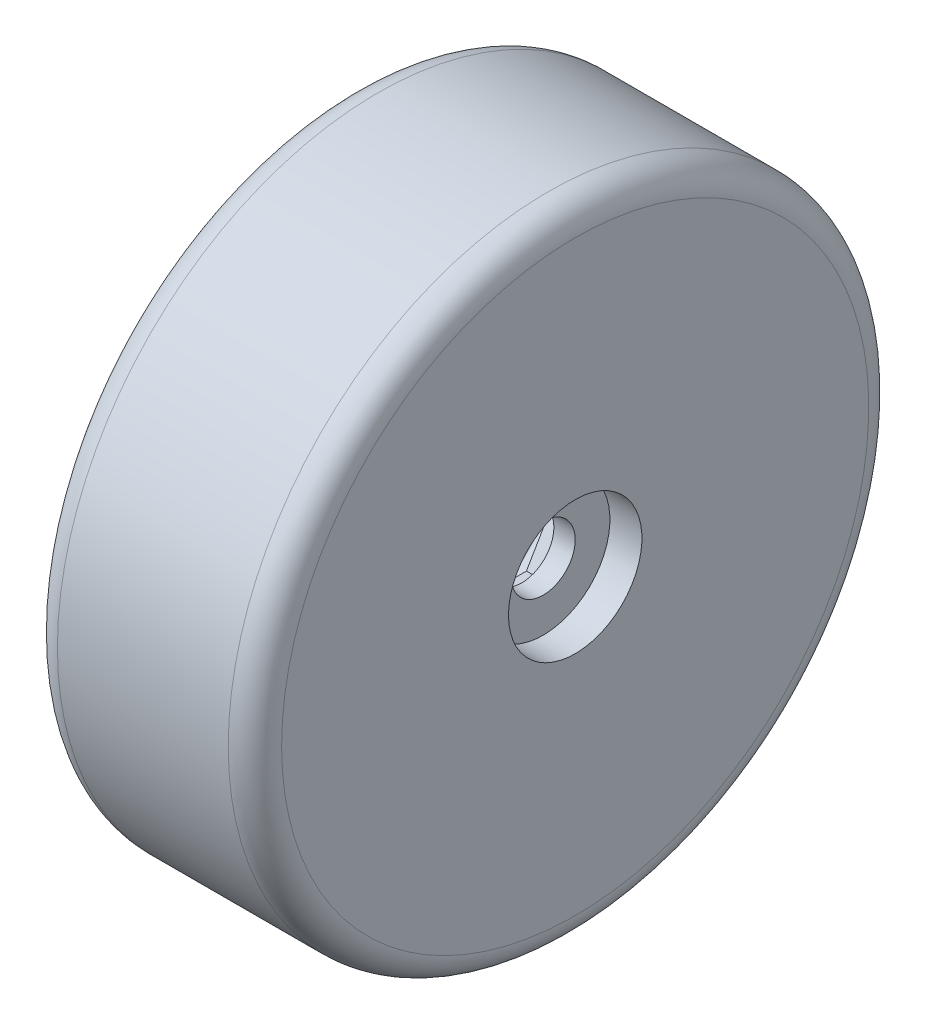
ISO-10303-21;
HEADER;
FILE_DESCRIPTION(('STEP AP214'),'2;1');
FILE_NAME('part.step','',(''),(''),'','','');
FILE_SCHEMA(('AUTOMOTIVE_DESIGN { 1 0 10303 214 1 1 1 1 }'));
ENDSEC;
DATA;
#1=APPLICATION_CONTEXT('core data for automotive mechanical design processes');
#2=APPLICATION_PROTOCOL_DEFINITION('international standard','automotive_design',2000,#1);
#3=PRODUCT_CONTEXT('',#1,'mechanical');
#4=PRODUCT('Part','Part','',(#3));
#5=PRODUCT_RELATED_PRODUCT_CATEGORY('part','',(#4));
#6=PRODUCT_DEFINITION_FORMATION('','',#4);
#7=PRODUCT_DEFINITION_CONTEXT('part definition',#1,'design');
#8=PRODUCT_DEFINITION('design','',#6,#7);
#9=PRODUCT_DEFINITION_SHAPE('','',#8);
#10=(LENGTH_UNIT() NAMED_UNIT(*) SI_UNIT(.MILLI.,.METRE.));
#11=(NAMED_UNIT(*) PLANE_ANGLE_UNIT() SI_UNIT($,.RADIAN.));
#12=(NAMED_UNIT(*) SI_UNIT($,.STERADIAN.) SOLID_ANGLE_UNIT());
#13=UNCERTAINTY_MEASURE_WITH_UNIT(LENGTH_MEASURE(1.E-05),#10,'distance_accuracy_value','');
#14=(GEOMETRIC_REPRESENTATION_CONTEXT(3) GLOBAL_UNCERTAINTY_ASSIGNED_CONTEXT((#13)) GLOBAL_UNIT_ASSIGNED_CONTEXT((#10,
#11,#12)) REPRESENTATION_CONTEXT('',''));
#15=CARTESIAN_POINT('',(0.,0.,0.));
#16=DIRECTION('',(0.,0.,1.));
#17=DIRECTION('',(1.,0.,0.));
#18=AXIS2_PLACEMENT_3D('',#15,#16,#17);
#19=CARTESIAN_POINT('',(-33.6279069767442,0.,0.));
#20=DIRECTION('',(-1.,0.,0.));
#21=DIRECTION('',(0.,0.,1.));
#22=AXIS2_PLACEMENT_3D('',#19,#20,#21);
#23=CYLINDRICAL_SURFACE('',#22,6.);
#24=CARTESIAN_POINT('',(-5.99999999999999,0.,0.));
#25=DIRECTION('',(-1.,0.,0.));
#26=DIRECTION('',(0.,0.,1.));
#27=AXIS2_PLACEMENT_3D('',#24,#25,#26);
#28=CIRCLE('',#27,6.);
#29=CARTESIAN_POINT('',(-5.99999999999999,0.,6.));
#30=VERTEX_POINT('',#29);
#31=EDGE_CURVE('E41',#30,#30,#28,.T.);
#32=ORIENTED_EDGE('',*,*,#31,.F.);
#33=EDGE_LOOP('',(#32));
#34=FACE_BOUND('',#33,.T.);
#35=CARTESIAN_POINT('',(-9.99999999999999,0.,0.));
#36=DIRECTION('',(-1.,0.,0.));
#37=DIRECTION('',(0.,0.,1.));
#38=AXIS2_PLACEMENT_3D('',#35,#36,#37);
#39=CIRCLE('',#38,6.);
#40=CARTESIAN_POINT('',(-9.99999999999999,0.,6.));
#41=VERTEX_POINT('',#40);
#42=EDGE_CURVE('E154',#41,#41,#39,.T.);
#43=ORIENTED_EDGE('',*,*,#42,.T.);
#44=EDGE_LOOP('',(#43));
#45=FACE_BOUND('',#44,.T.);
#46=ADVANCED_FACE('F38',(#34,#45),#23,.F.);
#47=CARTESIAN_POINT('',(0.,-6.,0.));
#48=DIRECTION('',(1.,0.,0.));
#49=DIRECTION('',(0.,0.,-1.));
#50=AXIS2_PLACEMENT_3D('',#47,#48,#49);
#51=PLANE('',#50);
#52=CARTESIAN_POINT('',(0.,0.,0.));
#53=DIRECTION('',(-1.,0.,0.));
#54=DIRECTION('',(0.,0.,1.));
#55=AXIS2_PLACEMENT_3D('',#52,#53,#54);
#56=CIRCLE('',#55,12.5);
#57=CARTESIAN_POINT('',(0.,0.,12.5));
#58=VERTEX_POINT('',#57);
#59=EDGE_CURVE('E222',#58,#58,#56,.T.);
#60=ORIENTED_EDGE('',*,*,#59,.T.);
#61=EDGE_LOOP('',(#60));
#62=FACE_BOUND('',#61,.T.);
#63=CARTESIAN_POINT('',(0.,0.,0.));
#64=DIRECTION('',(-1.,0.,0.));
#65=DIRECTION('',(0.,0.,1.));
#66=AXIS2_PLACEMENT_3D('',#63,#64,#65);
#67=CIRCLE('',#66,55.);
#68=CARTESIAN_POINT('',(0.,0.,55.));
#69=VERTEX_POINT('',#68);
#70=EDGE_CURVE('E11',#69,#69,#67,.T.);
#71=ORIENTED_EDGE('',*,*,#70,.F.);
#72=EDGE_LOOP('',(#71));
#73=FACE_BOUND('',#72,.T.);
#74=ADVANCED_FACE('F211',(#62,#73),#51,.T.);
#75=CARTESIAN_POINT('',(-4.99999999999999,0.,0.));
#76=DIRECTION('',(-1.,0.,0.));
#77=DIRECTION('',(0.,0.,1.));
#78=AXIS2_PLACEMENT_3D('',#75,#76,#77);
#79=TOROIDAL_SURFACE('',#78,55.,5.);
#80=ORIENTED_EDGE('',*,*,#70,.T.);
#81=EDGE_LOOP('',(#80));
#82=FACE_BOUND('',#81,.T.);
#83=CARTESIAN_POINT('',(-5.00000000000003,0.,0.));
#84=DIRECTION('',(-1.,0.,0.));
#85=DIRECTION('',(0.,0.,1.));
#86=AXIS2_PLACEMENT_3D('',#83,#84,#85);
#87=CIRCLE('',#86,60.);
#88=CARTESIAN_POINT('',(-5.00000000000003,0.,60.));
#89=VERTEX_POINT('',#88);
#90=EDGE_CURVE('E47',#89,#89,#87,.T.);
#91=ORIENTED_EDGE('',*,*,#90,.F.);
#92=EDGE_LOOP('',(#91));
#93=FACE_BOUND('',#92,.T.);
#94=ADVANCED_FACE('F216',(#82,#93),#79,.T.);
#95=CARTESIAN_POINT('',(-33.6279069767442,0.,0.));
#96=DIRECTION('',(-1.,0.,0.));
#97=DIRECTION('',(0.,0.,1.));
#98=AXIS2_PLACEMENT_3D('',#95,#96,#97);
#99=CYLINDRICAL_SURFACE('',#98,60.);
#100=ORIENTED_EDGE('',*,*,#90,.T.);
#101=EDGE_LOOP('',(#100));
#102=FACE_BOUND('',#101,.T.);
#103=CARTESIAN_POINT('',(-37.,0.,0.));
#104=DIRECTION('',(-1.,0.,0.));
#105=DIRECTION('',(0.,0.,1.));
#106=AXIS2_PLACEMENT_3D('',#103,#104,#105);
#107=CIRCLE('',#106,60.);
#108=CARTESIAN_POINT('',(-37.,0.,60.));
#109=VERTEX_POINT('',#108);
#110=EDGE_CURVE('E184',#109,#109,#107,.T.);
#111=ORIENTED_EDGE('',*,*,#110,.F.);
#112=EDGE_LOOP('',(#111));
#113=FACE_BOUND('',#112,.T.);
#114=ADVANCED_FACE('F276',(#102,#113),#99,.T.);
#115=CARTESIAN_POINT('',(-37.,0.,0.));
#116=DIRECTION('',(-1.,0.,0.));
#117=DIRECTION('',(0.,0.,1.));
#118=AXIS2_PLACEMENT_3D('',#115,#116,#117);
#119=TOROIDAL_SURFACE('',#118,55.,5.);
#120=ORIENTED_EDGE('',*,*,#110,.T.);
#121=EDGE_LOOP('',(#120));
#122=FACE_BOUND('',#121,.T.);
#123=CARTESIAN_POINT('',(-42.,0.,0.));
#124=DIRECTION('',(-1.,0.,0.));
#125=DIRECTION('',(0.,0.,1.));
#126=AXIS2_PLACEMENT_3D('',#123,#124,#125);
#127=CIRCLE('',#126,55.);
#128=CARTESIAN_POINT('',(-42.,0.,55.));
#129=VERTEX_POINT('',#128);
#130=EDGE_CURVE('E180',#129,#129,#127,.T.);
#131=ORIENTED_EDGE('',*,*,#130,.F.);
#132=EDGE_LOOP('',(#131));
#133=FACE_BOUND('',#132,.T.);
#134=ADVANCED_FACE('F272',(#122,#133),#119,.T.);
#135=CARTESIAN_POINT('',(-42.,-55.,0.));
#136=DIRECTION('',(-1.,0.,0.));
#137=DIRECTION('',(0.,0.,1.));
#138=AXIS2_PLACEMENT_3D('',#135,#136,#137);
#139=PLANE('',#138);
#140=ORIENTED_EDGE('',*,*,#130,.T.);
#141=EDGE_LOOP('',(#140));
#142=FACE_BOUND('',#141,.T.);
#143=CARTESIAN_POINT('',(-42.,0.,0.));
#144=DIRECTION('',(-1.,0.,0.));
#145=DIRECTION('',(0.,0.,1.));
#146=AXIS2_PLACEMENT_3D('',#143,#144,#145);
#147=CIRCLE('',#146,45.);
#148=CARTESIAN_POINT('',(-42.,0.,45.));
#149=VERTEX_POINT('',#148);
#150=EDGE_CURVE('E176',#149,#149,#147,.T.);
#151=ORIENTED_EDGE('',*,*,#150,.F.);
#152=EDGE_LOOP('',(#151));
#153=FACE_BOUND('',#152,.T.);
#154=ADVANCED_FACE('F268',(#142,#153),#139,.T.);
#155=CARTESIAN_POINT('',(-37.,0.,0.));
#156=DIRECTION('',(-1.,0.,0.));
#157=DIRECTION('',(0.,0.,1.));
#158=AXIS2_PLACEMENT_3D('',#155,#156,#157);
#159=TOROIDAL_SURFACE('',#158,45.,5.);
#160=ORIENTED_EDGE('',*,*,#150,.T.);
#161=EDGE_LOOP('',(#160));
#162=FACE_BOUND('',#161,.T.);
#163=CARTESIAN_POINT('',(-37.,0.,0.));
#164=DIRECTION('',(-1.,0.,0.));
#165=DIRECTION('',(0.,0.,1.));
#166=AXIS2_PLACEMENT_3D('',#163,#164,#165);
#167=CIRCLE('',#166,40.);
#168=CARTESIAN_POINT('',(-37.,0.,40.));
#169=VERTEX_POINT('',#168);
#170=EDGE_CURVE('E172',#169,#169,#167,.T.);
#171=ORIENTED_EDGE('',*,*,#170,.F.);
#172=EDGE_LOOP('',(#171));
#173=FACE_BOUND('',#172,.T.);
#174=ADVANCED_FACE('F264',(#162,#173),#159,.T.);
#175=CARTESIAN_POINT('',(-33.6279069767442,0.,0.));
#176=DIRECTION('',(-1.,0.,0.));
#177=DIRECTION('',(0.,0.,1.));
#178=AXIS2_PLACEMENT_3D('',#175,#176,#177);
#179=CYLINDRICAL_SURFACE('',#178,40.);
#180=ORIENTED_EDGE('',*,*,#170,.T.);
#181=EDGE_LOOP('',(#180));
#182=FACE_BOUND('',#181,.T.);
#183=CARTESIAN_POINT('',(-19.,0.,0.));
#184=DIRECTION('',(-1.,0.,0.));
#185=DIRECTION('',(0.,0.,1.));
#186=AXIS2_PLACEMENT_3D('',#183,#184,#185);
#187=CIRCLE('',#186,40.);
#188=CARTESIAN_POINT('',(-19.,0.,40.));
#189=VERTEX_POINT('',#188);
#190=EDGE_CURVE('E168',#189,#189,#187,.T.);
#191=ORIENTED_EDGE('',*,*,#190,.F.);
#192=EDGE_LOOP('',(#191));
#193=FACE_BOUND('',#192,.T.);
#194=ADVANCED_FACE('F260',(#182,#193),#179,.F.);
#195=CARTESIAN_POINT('',(-19.,0.,0.));
#196=DIRECTION('',(-1.,0.,0.));
#197=DIRECTION('',(0.,0.,1.));
#198=AXIS2_PLACEMENT_3D('',#195,#196,#197);
#199=TOROIDAL_SURFACE('',#198,35.,5.);
#200=ORIENTED_EDGE('',*,*,#190,.T.);
#201=EDGE_LOOP('',(#200));
#202=FACE_BOUND('',#201,.T.);
#203=CARTESIAN_POINT('',(-14.,0.,0.));
#204=DIRECTION('',(-1.,0.,0.));
#205=DIRECTION('',(0.,0.,1.));
#206=AXIS2_PLACEMENT_3D('',#203,#204,#205);
#207=CIRCLE('',#206,35.);
#208=CARTESIAN_POINT('',(-14.,0.,35.));
#209=VERTEX_POINT('',#208);
#210=EDGE_CURVE('E164',#209,#209,#207,.T.);
#211=ORIENTED_EDGE('',*,*,#210,.F.);
#212=EDGE_LOOP('',(#211));
#213=FACE_BOUND('',#212,.T.);
#214=ADVANCED_FACE('F257',(#202,#213),#199,.F.);
#215=CARTESIAN_POINT('',(-14.,-35.,0.));
#216=DIRECTION('',(-1.,0.,0.));
#217=DIRECTION('',(0.,0.,1.));
#218=AXIS2_PLACEMENT_3D('',#215,#216,#217);
#219=PLANE('',#218);
#220=DIRECTION('',(0.,0.86362668047458,-0.504131884304552));
#221=VECTOR('',#220,1.);
#222=CARTESIAN_POINT('',(-14.,0.046892696752293,9.81484255647154));
#223=LINE('',#222,#221);
#224=CARTESIAN_POINT('',(-14.,0.046892696752293,9.81484255647154));
#225=VERTEX_POINT('',#224);
#226=CARTESIAN_POINT('',(-14.,8.52334933642509,4.86681101159633));
#227=VERTEX_POINT('',#226);
#228=EDGE_CURVE('E55',#225,#227,#223,.T.);
#229=ORIENTED_EDGE('',*,*,#228,.F.);
#230=DIRECTION('',(0.,0.868404358902749,0.495856702524736));
#231=VECTOR('',#230,1.);
#232=CARTESIAN_POINT('',(-14.,-8.47645663967281,4.94803154487521));
#233=LINE('',#232,#231);
#234=CARTESIAN_POINT('',(-14.,-8.47645663967281,4.94803154487521));
#235=VERTEX_POINT('',#234);
#236=EDGE_CURVE('E148',#235,#225,#233,.T.);
#237=ORIENTED_EDGE('',*,*,#236,.F.);
#238=DIRECTION('',(0.,0.00477767842817007,0.999988586829288));
#239=VECTOR('',#238,1.);
#240=CARTESIAN_POINT('',(-14.,-8.5233493364251,-4.86681101159632));
#241=LINE('',#240,#239);
#242=CARTESIAN_POINT('',(-14.,-8.5233493364251,-4.86681101159632));
#243=VERTEX_POINT('',#242);
#244=EDGE_CURVE('E145',#243,#235,#241,.T.);
#245=ORIENTED_EDGE('',*,*,#244,.F.);
#246=DIRECTION('',(0.,-0.86362668047458,0.504131884304552));
#247=VECTOR('',#246,1.);
#248=CARTESIAN_POINT('',(-14.,-0.0468926967522902,-9.81484255647153));
#249=LINE('',#248,#247);
#250=CARTESIAN_POINT('',(-14.,-0.0468926967522902,-9.81484255647153));
#251=VERTEX_POINT('',#250);
#252=EDGE_CURVE('E103',#251,#243,#249,.T.);
#253=ORIENTED_EDGE('',*,*,#252,.F.);
#254=DIRECTION('',(0.,-0.868404358902749,-0.495856702524736));
#255=VECTOR('',#254,1.);
#256=CARTESIAN_POINT('',(-14.,8.47645663967281,-4.9480315448752));
#257=LINE('',#256,#255);
#258=CARTESIAN_POINT('',(-14.,8.47645663967281,-4.9480315448752));
#259=VERTEX_POINT('',#258);
#260=EDGE_CURVE('E139',#259,#251,#257,.T.);
#261=ORIENTED_EDGE('',*,*,#260,.F.);
#262=DIRECTION('',(0.,-0.00477767842816972,-0.999988586829288));
#263=VECTOR('',#262,1.);
#264=CARTESIAN_POINT('',(-14.,8.5233493364251,4.86681101159633));
#265=LINE('',#264,#263);
#266=EDGE_CURVE('E135',#227,#259,#265,.T.);
#267=ORIENTED_EDGE('',*,*,#266,.F.);
#268=EDGE_LOOP('',(#229,#237,#245,#253,#261,#267));
#269=FACE_BOUND('',#268,.T.);
#270=ORIENTED_EDGE('',*,*,#210,.T.);
#271=EDGE_LOOP('',(#270));
#272=FACE_BOUND('',#271,.T.);
#273=ADVANCED_FACE('F238',(#269,#272),#219,.T.);
#274=CARTESIAN_POINT('',(-9.99999999999999,0.046892696752293,9.81484255647154));
#275=DIRECTION('',(0.,0.504131884304552,0.86362668047458));
#276=DIRECTION('',(0.,-0.86362668047458,0.504131884304552));
#277=AXIS2_PLACEMENT_3D('',#274,#275,#276);
#278=PLANE('',#277);
#279=ORIENTED_EDGE('',*,*,#228,.T.);
#280=DIRECTION('',(-1.,0.,0.));
#281=VECTOR('',#280,1.);
#282=CARTESIAN_POINT('',(-9.99999999999999,8.5233493364251,4.86681101159633));
#283=LINE('',#282,#281);
#284=CARTESIAN_POINT('',(-9.99999999999999,8.5233493364251,4.86681101159633));
#285=VERTEX_POINT('',#284);
#286=EDGE_CURVE('E85',#285,#227,#283,.T.);
#287=ORIENTED_EDGE('',*,*,#286,.F.);
#288=DIRECTION('',(0.,0.86362668047458,-0.504131884304552));
#289=VECTOR('',#288,1.);
#290=CARTESIAN_POINT('',(-9.99999999999999,0.046892696752293,9.81484255647154));
#291=LINE('',#290,#289);
#292=CARTESIAN_POINT('',(-9.99999999999999,0.046892696752293,9.81484255647154));
#293=VERTEX_POINT('',#292);
#294=EDGE_CURVE('E151',#293,#285,#291,.T.);
#295=ORIENTED_EDGE('',*,*,#294,.F.);
#296=DIRECTION('',(-1.,0.,0.));
#297=VECTOR('',#296,1.);
#298=CARTESIAN_POINT('',(-9.99999999999999,0.046892696752293,9.81484255647154));
#299=LINE('',#298,#297);
#300=EDGE_CURVE('E63',#293,#225,#299,.T.);
#301=ORIENTED_EDGE('',*,*,#300,.T.);
#302=EDGE_LOOP('',(#279,#287,#295,#301));
#303=FACE_BOUND('',#302,.T.);
#304=ADVANCED_FACE('F243',(#303),#278,.F.);
#305=CARTESIAN_POINT('',(-9.99999999999999,-8.47645663967281,4.94803154487521));
#306=DIRECTION('',(0.,-0.495856702524736,0.868404358902749));
#307=DIRECTION('',(0.,-0.868404358902749,-0.495856702524736));
#308=AXIS2_PLACEMENT_3D('',#305,#306,#307);
#309=PLANE('',#308);
#310=ORIENTED_EDGE('',*,*,#236,.T.);
#311=ORIENTED_EDGE('',*,*,#300,.F.);
#312=DIRECTION('',(0.,0.868404358902749,0.495856702524736));
#313=VECTOR('',#312,1.);
#314=CARTESIAN_POINT('',(-9.99999999999999,-8.47645663967281,4.94803154487521));
#315=LINE('',#314,#313);
#316=CARTESIAN_POINT('',(-9.99999999999999,-8.47645663967281,4.94803154487521));
#317=VERTEX_POINT('',#316);
#318=EDGE_CURVE('E117',#317,#293,#315,.T.);
#319=ORIENTED_EDGE('',*,*,#318,.F.);
#320=DIRECTION('',(-1.,0.,0.));
#321=VECTOR('',#320,1.);
#322=CARTESIAN_POINT('',(-9.99999999999999,-8.47645663967281,4.94803154487521));
#323=LINE('',#322,#321);
#324=EDGE_CURVE('E108',#317,#235,#323,.T.);
#325=ORIENTED_EDGE('',*,*,#324,.T.);
#326=EDGE_LOOP('',(#310,#311,#319,#325));
#327=FACE_BOUND('',#326,.T.);
#328=ADVANCED_FACE('F241',(#327),#309,.F.);
#329=CARTESIAN_POINT('',(-9.99999999999999,-8.5233493364251,-4.86681101159632));
#330=DIRECTION('',(0.,-0.999988586829288,0.00477767842817007));
#331=DIRECTION('',(0.,-0.00477767842817007,-0.999988586829288));
#332=AXIS2_PLACEMENT_3D('',#329,#330,#331);
#333=PLANE('',#332);
#334=ORIENTED_EDGE('',*,*,#244,.T.);
#335=ORIENTED_EDGE('',*,*,#324,.F.);
#336=DIRECTION('',(0.,0.00477767842817007,0.999988586829288));
#337=VECTOR('',#336,1.);
#338=CARTESIAN_POINT('',(-9.99999999999999,-8.5233493364251,-4.86681101159632));
#339=LINE('',#338,#337);
#340=CARTESIAN_POINT('',(-9.99999999999999,-8.5233493364251,-4.86681101159632));
#341=VERTEX_POINT('',#340);
#342=EDGE_CURVE('E112',#341,#317,#339,.T.);
#343=ORIENTED_EDGE('',*,*,#342,.F.);
#344=DIRECTION('',(-1.,0.,0.));
#345=VECTOR('',#344,1.);
#346=CARTESIAN_POINT('',(-9.99999999999999,-8.5233493364251,-4.86681101159632));
#347=LINE('',#346,#345);
#348=EDGE_CURVE('E96',#341,#243,#347,.T.);
#349=ORIENTED_EDGE('',*,*,#348,.T.);
#350=EDGE_LOOP('',(#334,#335,#343,#349));
#351=FACE_BOUND('',#350,.T.);
#352=ADVANCED_FACE('F113',(#351),#333,.F.);
#353=CARTESIAN_POINT('',(-9.99999999999999,-0.0468926967522902,-9.81484255647153));
#354=DIRECTION('',(0.,-0.504131884304552,-0.86362668047458));
#355=DIRECTION('',(0.,0.86362668047458,-0.504131884304552));
#356=AXIS2_PLACEMENT_3D('',#353,#354,#355);
#357=PLANE('',#356);
#358=ORIENTED_EDGE('',*,*,#252,.T.);
#359=ORIENTED_EDGE('',*,*,#348,.F.);
#360=DIRECTION('',(0.,-0.86362668047458,0.504131884304552));
#361=VECTOR('',#360,1.);
#362=CARTESIAN_POINT('',(-9.99999999999999,-0.0468926967522902,-9.81484255647153));
#363=LINE('',#362,#361);
#364=CARTESIAN_POINT('',(-9.99999999999999,-0.0468926967522902,-9.81484255647153));
#365=VERTEX_POINT('',#364);
#366=EDGE_CURVE('E100',#365,#341,#363,.T.);
#367=ORIENTED_EDGE('',*,*,#366,.F.);
#368=DIRECTION('',(-1.,0.,0.));
#369=VECTOR('',#368,1.);
#370=CARTESIAN_POINT('',(-9.99999999999999,-0.0468926967522902,-9.81484255647153));
#371=LINE('',#370,#369);
#372=EDGE_CURVE('E109',#365,#251,#371,.T.);
#373=ORIENTED_EDGE('',*,*,#372,.T.);
#374=EDGE_LOOP('',(#358,#359,#367,#373));
#375=FACE_BOUND('',#374,.T.);
#376=ADVANCED_FACE('F98',(#375),#357,.F.);
#377=CARTESIAN_POINT('',(-9.99999999999999,8.47645663967281,-4.9480315448752));
#378=DIRECTION('',(0.,0.495856702524736,-0.868404358902749));
#379=DIRECTION('',(0.,0.868404358902749,0.495856702524736));
#380=AXIS2_PLACEMENT_3D('',#377,#378,#379);
#381=PLANE('',#380);
#382=ORIENTED_EDGE('',*,*,#260,.T.);
#383=ORIENTED_EDGE('',*,*,#372,.F.);
#384=DIRECTION('',(0.,-0.868404358902749,-0.495856702524736));
#385=VECTOR('',#384,1.);
#386=CARTESIAN_POINT('',(-9.99999999999999,8.47645663967281,-4.9480315448752));
#387=LINE('',#386,#385);
#388=CARTESIAN_POINT('',(-9.99999999999999,8.47645663967281,-4.9480315448752));
#389=VERTEX_POINT('',#388);
#390=EDGE_CURVE('E123',#389,#365,#387,.T.);
#391=ORIENTED_EDGE('',*,*,#390,.F.);
#392=DIRECTION('',(-1.,0.,0.));
#393=VECTOR('',#392,1.);
#394=CARTESIAN_POINT('',(-9.99999999999999,8.47645663967281,-4.9480315448752));
#395=LINE('',#394,#393);
#396=EDGE_CURVE('E159',#389,#259,#395,.T.);
#397=ORIENTED_EDGE('',*,*,#396,.T.);
#398=EDGE_LOOP('',(#382,#383,#391,#397));
#399=FACE_BOUND('',#398,.T.);
#400=ADVANCED_FACE('F206',(#399),#381,.F.);
#401=CARTESIAN_POINT('',(-9.99999999999999,8.5233493364251,4.86681101159633));
#402=DIRECTION('',(0.,0.999988586829288,-0.00477767842816972));
#403=DIRECTION('',(0.,0.00477767842816972,0.999988586829288));
#404=AXIS2_PLACEMENT_3D('',#401,#402,#403);
#405=PLANE('',#404);
#406=ORIENTED_EDGE('',*,*,#266,.T.);
#407=ORIENTED_EDGE('',*,*,#396,.F.);
#408=DIRECTION('',(0.,-0.00477767842816972,-0.999988586829288));
#409=VECTOR('',#408,1.);
#410=CARTESIAN_POINT('',(-9.99999999999999,8.5233493364251,4.86681101159633));
#411=LINE('',#410,#409);
#412=EDGE_CURVE('E127',#285,#389,#411,.T.);
#413=ORIENTED_EDGE('',*,*,#412,.F.);
#414=ORIENTED_EDGE('',*,*,#286,.T.);
#415=EDGE_LOOP('',(#406,#407,#413,#414));
#416=FACE_BOUND('',#415,.T.);
#417=ADVANCED_FACE('F197',(#416),#405,.F.);
#418=CARTESIAN_POINT('',(-9.99999999999999,0.,0.));
#419=DIRECTION('',(-1.,0.,0.));
#420=DIRECTION('',(0.,0.,1.));
#421=AXIS2_PLACEMENT_3D('',#418,#419,#420);
#422=PLANE('',#421);
#423=ORIENTED_EDGE('',*,*,#42,.F.);
#424=EDGE_LOOP('',(#423));
#425=FACE_BOUND('',#424,.T.);
#426=ORIENTED_EDGE('',*,*,#294,.T.);
#427=ORIENTED_EDGE('',*,*,#412,.T.);
#428=ORIENTED_EDGE('',*,*,#390,.T.);
#429=ORIENTED_EDGE('',*,*,#366,.T.);
#430=ORIENTED_EDGE('',*,*,#342,.T.);
#431=ORIENTED_EDGE('',*,*,#318,.T.);
#432=EDGE_LOOP('',(#426,#427,#428,#429,#430,#431));
#433=FACE_BOUND('',#432,.T.);
#434=ADVANCED_FACE('F120',(#425,#433),#422,.T.);
#435=CARTESIAN_POINT('',(-5.99999999999999,0.,0.));
#436=DIRECTION('',(-1.,0.,0.));
#437=DIRECTION('',(0.,0.,1.));
#438=AXIS2_PLACEMENT_3D('',#435,#436,#437);
#439=CYLINDRICAL_SURFACE('',#438,12.5);
#440=ORIENTED_EDGE('',*,*,#59,.F.);
#441=EDGE_LOOP('',(#440));
#442=FACE_BOUND('',#441,.T.);
#443=CARTESIAN_POINT('',(-5.99999999999999,0.,0.));
#444=DIRECTION('',(-1.,0.,0.));
#445=DIRECTION('',(0.,0.,1.));
#446=AXIS2_PLACEMENT_3D('',#443,#444,#445);
#447=CIRCLE('',#446,12.5);
#448=CARTESIAN_POINT('',(-5.99999999999999,0.,12.5));
#449=VERTEX_POINT('',#448);
#450=EDGE_CURVE('E225',#449,#449,#447,.T.);
#451=ORIENTED_EDGE('',*,*,#450,.T.);
#452=EDGE_LOOP('',(#451));
#453=FACE_BOUND('',#452,.T.);
#454=ADVANCED_FACE('F196',(#442,#453),#439,.F.);
#455=CARTESIAN_POINT('',(-5.99999999999999,-12.5,0.));
#456=DIRECTION('',(-1.,0.,0.));
#457=DIRECTION('',(0.,0.,1.));
#458=AXIS2_PLACEMENT_3D('',#455,#456,#457);
#459=PLANE('',#458);
#460=ORIENTED_EDGE('',*,*,#31,.T.);
#461=EDGE_LOOP('',(#460));
#462=FACE_BOUND('',#461,.T.);
#463=ORIENTED_EDGE('',*,*,#450,.F.);
#464=EDGE_LOOP('',(#463));
#465=FACE_BOUND('',#464,.T.);
#466=ADVANCED_FACE('F203',(#462,#465),#459,.F.);
#467=CLOSED_SHELL('',(#46,#74,#94,#114,#134,#154,#174,#194,#214,#273,#304,#328,#352,#376,#400,
#417,#434,#454,#466));
#468=MANIFOLD_SOLID_BREP('B2',#467);
#469=ADVANCED_BREP_SHAPE_REPRESENTATION('',(#18,#468),#14);
#470=SHAPE_DEFINITION_REPRESENTATION(#9,#469);
ENDSEC;
END-ISO-10303-21;
